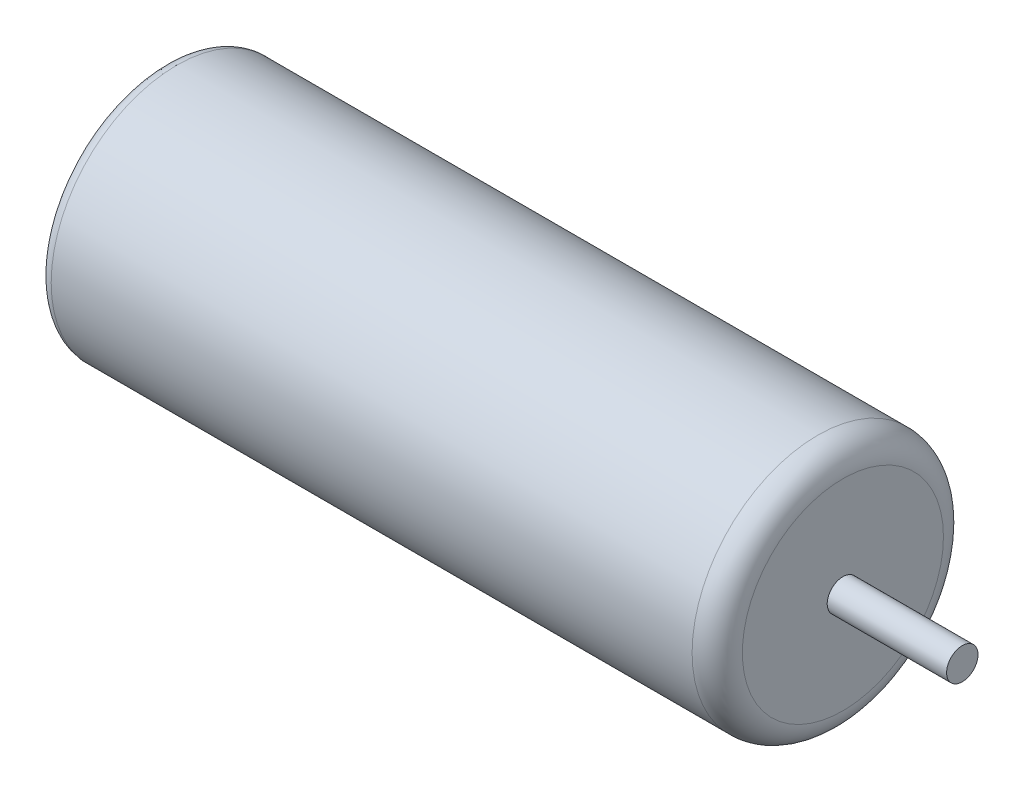
ISO-10303-21;
HEADER;
FILE_DESCRIPTION(('STEP AP214'),'2;1');
FILE_NAME('part.step','',(''),(''),'','','');
FILE_SCHEMA(('AUTOMOTIVE_DESIGN { 1 0 10303 214 1 1 1 1 }'));
ENDSEC;
DATA;
#1=APPLICATION_CONTEXT('core data for automotive mechanical design processes');
#2=APPLICATION_PROTOCOL_DEFINITION('international standard','automotive_design',2000,#1);
#3=PRODUCT_CONTEXT('',#1,'mechanical');
#4=PRODUCT('Part','Part','',(#3));
#5=PRODUCT_RELATED_PRODUCT_CATEGORY('part','',(#4));
#6=PRODUCT_DEFINITION_FORMATION('','',#4);
#7=PRODUCT_DEFINITION_CONTEXT('part definition',#1,'design');
#8=PRODUCT_DEFINITION('design','',#6,#7);
#9=PRODUCT_DEFINITION_SHAPE('','',#8);
#10=(LENGTH_UNIT() NAMED_UNIT(*) SI_UNIT(.MILLI.,.METRE.));
#11=(NAMED_UNIT(*) PLANE_ANGLE_UNIT() SI_UNIT($,.RADIAN.));
#12=(NAMED_UNIT(*) SI_UNIT($,.STERADIAN.) SOLID_ANGLE_UNIT());
#13=UNCERTAINTY_MEASURE_WITH_UNIT(LENGTH_MEASURE(1.E-05),#10,'distance_accuracy_value','');
#14=(GEOMETRIC_REPRESENTATION_CONTEXT(3) GLOBAL_UNCERTAINTY_ASSIGNED_CONTEXT((#13)) GLOBAL_UNIT_ASSIGNED_CONTEXT((#10,
#11,#12)) REPRESENTATION_CONTEXT('',''));
#15=CARTESIAN_POINT('',(0.,0.,0.));
#16=DIRECTION('',(0.,0.,1.));
#17=DIRECTION('',(1.,0.,0.));
#18=AXIS2_PLACEMENT_3D('',#15,#16,#17);
#19=CARTESIAN_POINT('',(108.,0.,0.));
#20=DIRECTION('',(-1.,0.,0.));
#21=DIRECTION('',(0.,0.,1.));
#22=AXIS2_PLACEMENT_3D('',#19,#20,#21);
#23=CYLINDRICAL_SURFACE('',#22,20.);
#24=CARTESIAN_POINT('',(104.,0.,0.));
#25=DIRECTION('',(1.,0.,0.));
#26=DIRECTION('',(0.,0.,-1.));
#27=AXIS2_PLACEMENT_3D('',#24,#25,#26);
#28=CIRCLE('',#27,20.);
#29=CARTESIAN_POINT('',(104.,0.,-20.));
#30=VERTEX_POINT('',#29);
#31=EDGE_CURVE('E10',#30,#30,#28,.F.);
#32=ORIENTED_EDGE('',*,*,#31,.T.);
#33=EDGE_LOOP('',(#32));
#34=FACE_BOUND('',#33,.T.);
#35=CARTESIAN_POINT('',(2.,0.,0.));
#36=DIRECTION('',(1.,0.,0.));
#37=DIRECTION('',(0.,0.,-1.));
#38=AXIS2_PLACEMENT_3D('',#35,#36,#37);
#39=CIRCLE('',#38,20.);
#40=CARTESIAN_POINT('',(2.,0.,-20.));
#41=VERTEX_POINT('',#40);
#42=EDGE_CURVE('E55',#41,#41,#39,.T.);
#43=ORIENTED_EDGE('',*,*,#42,.T.);
#44=EDGE_LOOP('',(#43));
#45=FACE_BOUND('',#44,.T.);
#46=ADVANCED_FACE('F37',(#34,#45),#23,.T.);
#47=CARTESIAN_POINT('',(108.,0.,0.));
#48=DIRECTION('',(1.,0.,0.));
#49=DIRECTION('',(0.,0.,-1.));
#50=AXIS2_PLACEMENT_3D('',#47,#48,#49);
#51=PLANE('',#50);
#52=CARTESIAN_POINT('',(108.,0.,0.));
#53=DIRECTION('',(1.,0.,0.));
#54=DIRECTION('',(0.,0.,-1.));
#55=AXIS2_PLACEMENT_3D('',#52,#53,#54);
#56=CIRCLE('',#55,16.);
#57=CARTESIAN_POINT('',(108.,0.,-16.));
#58=VERTEX_POINT('',#57);
#59=EDGE_CURVE('E45',#58,#58,#56,.T.);
#60=ORIENTED_EDGE('',*,*,#59,.T.);
#61=EDGE_LOOP('',(#60));
#62=FACE_BOUND('',#61,.T.);
#63=CARTESIAN_POINT('',(108.,0.,0.));
#64=DIRECTION('',(1.,0.,0.));
#65=DIRECTION('',(0.,0.,-1.));
#66=AXIS2_PLACEMENT_3D('',#63,#64,#65);
#67=CIRCLE('',#66,2.5);
#68=CARTESIAN_POINT('',(108.,0.,-2.5));
#69=VERTEX_POINT('',#68);
#70=EDGE_CURVE('E62',#69,#69,#67,.T.);
#71=ORIENTED_EDGE('',*,*,#70,.F.);
#72=EDGE_LOOP('',(#71));
#73=FACE_BOUND('',#72,.T.);
#74=ADVANCED_FACE('F79',(#62,#73),#51,.T.);
#75=CARTESIAN_POINT('',(0.,0.,0.));
#76=DIRECTION('',(1.,0.,0.));
#77=DIRECTION('',(0.,0.,-1.));
#78=AXIS2_PLACEMENT_3D('',#75,#76,#77);
#79=PLANE('',#78);
#80=CARTESIAN_POINT('',(0.,0.,0.));
#81=DIRECTION('',(1.,0.,0.));
#82=DIRECTION('',(0.,0.,-1.));
#83=AXIS2_PLACEMENT_3D('',#80,#81,#82);
#84=CIRCLE('',#83,18.);
#85=CARTESIAN_POINT('',(0.,0.,-18.));
#86=VERTEX_POINT('',#85);
#87=EDGE_CURVE('E50',#86,#86,#84,.F.);
#88=ORIENTED_EDGE('',*,*,#87,.T.);
#89=EDGE_LOOP('',(#88));
#90=FACE_BOUND('',#89,.T.);
#91=ADVANCED_FACE('F75',(#90),#79,.F.);
#92=CARTESIAN_POINT('',(127.,0.,0.));
#93=DIRECTION('',(-1.,0.,0.));
#94=DIRECTION('',(0.,0.,1.));
#95=AXIS2_PLACEMENT_3D('',#92,#93,#94);
#96=CYLINDRICAL_SURFACE('',#95,2.5);
#97=CARTESIAN_POINT('',(127.,0.,0.));
#98=DIRECTION('',(1.,0.,0.));
#99=DIRECTION('',(0.,0.,-1.));
#100=AXIS2_PLACEMENT_3D('',#97,#98,#99);
#101=CIRCLE('',#100,2.5);
#102=CARTESIAN_POINT('',(127.,0.,-2.5));
#103=VERTEX_POINT('',#102);
#104=EDGE_CURVE('E61',#103,#103,#101,.T.);
#105=ORIENTED_EDGE('',*,*,#104,.F.);
#106=EDGE_LOOP('',(#105));
#107=FACE_BOUND('',#106,.T.);
#108=ORIENTED_EDGE('',*,*,#70,.T.);
#109=EDGE_LOOP('',(#108));
#110=FACE_BOUND('',#109,.T.);
#111=ADVANCED_FACE('F72',(#107,#110),#96,.T.);
#112=CARTESIAN_POINT('',(127.,0.,0.));
#113=DIRECTION('',(1.,0.,0.));
#114=DIRECTION('',(0.,0.,-1.));
#115=AXIS2_PLACEMENT_3D('',#112,#113,#114);
#116=PLANE('',#115);
#117=ORIENTED_EDGE('',*,*,#104,.T.);
#118=EDGE_LOOP('',(#117));
#119=FACE_BOUND('',#118,.T.);
#120=ADVANCED_FACE('F70',(#119),#116,.T.);
#121=CARTESIAN_POINT('',(2.,0.,0.));
#122=DIRECTION('',(1.,0.,0.));
#123=DIRECTION('',(0.,0.,-1.));
#124=AXIS2_PLACEMENT_3D('',#121,#122,#123);
#125=TOROIDAL_SURFACE('',#124,18.,2.);
#126=ORIENTED_EDGE('',*,*,#87,.F.);
#127=EDGE_LOOP('',(#126));
#128=FACE_BOUND('',#127,.T.);
#129=ORIENTED_EDGE('',*,*,#42,.F.);
#130=EDGE_LOOP('',(#129));
#131=FACE_BOUND('',#130,.T.);
#132=ADVANCED_FACE('F90',(#128,#131),#125,.T.);
#133=CARTESIAN_POINT('',(104.,0.,0.));
#134=DIRECTION('',(1.,0.,0.));
#135=DIRECTION('',(0.,0.,-1.));
#136=AXIS2_PLACEMENT_3D('',#133,#134,#135);
#137=TOROIDAL_SURFACE('',#136,16.,4.);
#138=ORIENTED_EDGE('',*,*,#31,.F.);
#139=EDGE_LOOP('',(#138));
#140=FACE_BOUND('',#139,.T.);
#141=ORIENTED_EDGE('',*,*,#59,.F.);
#142=EDGE_LOOP('',(#141));
#143=FACE_BOUND('',#142,.T.);
#144=ADVANCED_FACE('F39',(#140,#143),#137,.T.);
#145=CLOSED_SHELL('',(#46,#74,#91,#111,#120,#132,#144));
#146=MANIFOLD_SOLID_BREP('B2',#145);
#147=ADVANCED_BREP_SHAPE_REPRESENTATION('',(#18,#146),#14);
#148=SHAPE_DEFINITION_REPRESENTATION(#9,#147);
ENDSEC;
END-ISO-10303-21;
